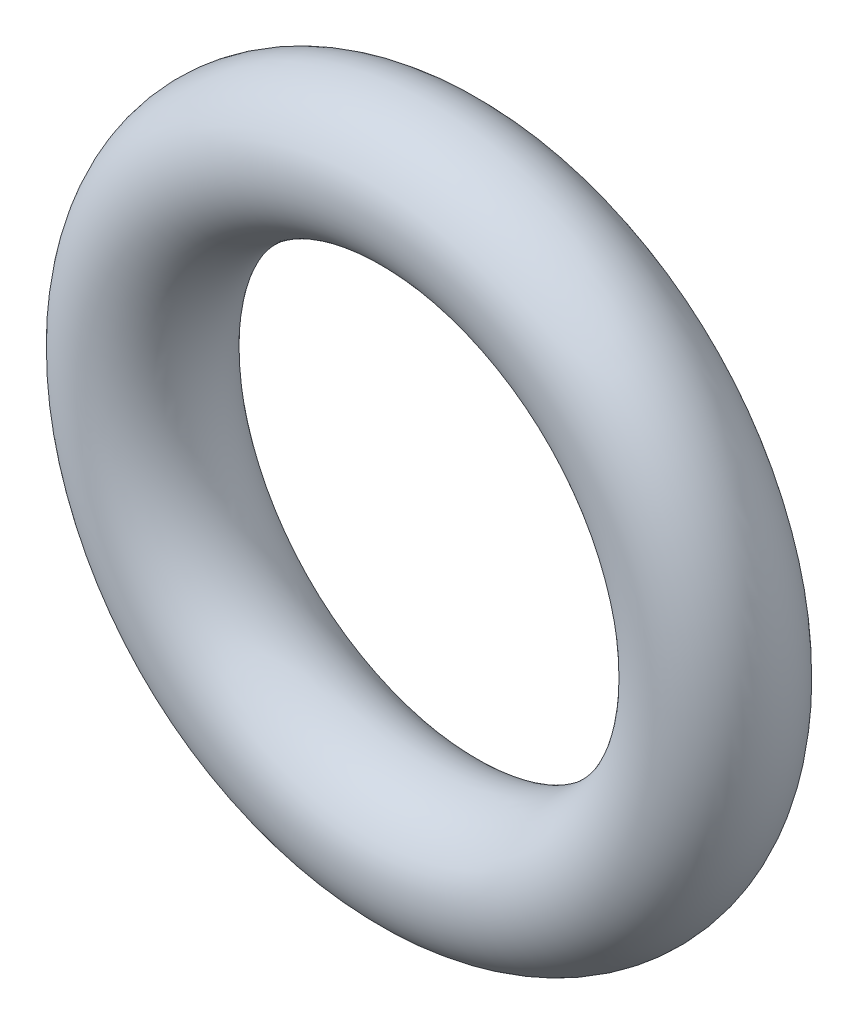
ISO-10303-21;
HEADER;
FILE_DESCRIPTION(('STEP AP214'),'2;1');
FILE_NAME('part.step','',(''),(''),'','','');
FILE_SCHEMA(('AUTOMOTIVE_DESIGN { 1 0 10303 214 1 1 1 1 }'));
ENDSEC;
DATA;
#1=APPLICATION_CONTEXT('core data for automotive mechanical design processes');
#2=APPLICATION_PROTOCOL_DEFINITION('international standard','automotive_design',2000,#1);
#3=PRODUCT_CONTEXT('',#1,'mechanical');
#4=PRODUCT('Part','Part','',(#3));
#5=PRODUCT_RELATED_PRODUCT_CATEGORY('part','',(#4));
#6=PRODUCT_DEFINITION_FORMATION('','',#4);
#7=PRODUCT_DEFINITION_CONTEXT('part definition',#1,'design');
#8=PRODUCT_DEFINITION('design','',#6,#7);
#9=PRODUCT_DEFINITION_SHAPE('','',#8);
#10=(LENGTH_UNIT() NAMED_UNIT(*) SI_UNIT(.MILLI.,.METRE.));
#11=(NAMED_UNIT(*) PLANE_ANGLE_UNIT() SI_UNIT($,.RADIAN.));
#12=(NAMED_UNIT(*) SI_UNIT($,.STERADIAN.) SOLID_ANGLE_UNIT());
#13=UNCERTAINTY_MEASURE_WITH_UNIT(LENGTH_MEASURE(1.E-05),#10,'distance_accuracy_value','');
#14=(GEOMETRIC_REPRESENTATION_CONTEXT(3) GLOBAL_UNCERTAINTY_ASSIGNED_CONTEXT((#13)) GLOBAL_UNIT_ASSIGNED_CONTEXT((#10,
#11,#12)) REPRESENTATION_CONTEXT('',''));
#15=CARTESIAN_POINT('',(0.,0.,0.));
#16=DIRECTION('',(0.,0.,1.));
#17=DIRECTION('',(1.,0.,0.));
#18=AXIS2_PLACEMENT_3D('',#15,#16,#17);
#19=CARTESIAN_POINT('',(0.,0.,0.));
#20=DIRECTION('',(0.,0.,1.));
#21=DIRECTION('',(1.,0.,0.));
#22=AXIS2_PLACEMENT_3D('',#19,#20,#21);
#23=TOROIDAL_SURFACE('',#22,2.1,0.5);
#24=CARTESIAN_POINT('',(2.1,0.,0.));
#25=DIRECTION('',(0.,1.,0.));
#26=DIRECTION('',(-1.,0.,0.));
#27=AXIS2_PLACEMENT_3D('',#24,#25,#26);
#28=CIRCLE('',#27,0.5);
#29=CARTESIAN_POINT('',(2.6,0.,0.));
#30=VERTEX_POINT('',#29);
#31=EDGE_CURVE('E11',#30,#30,#28,.T.);
#32=CARTESIAN_POINT('',(0.,0.,0.));
#33=DIRECTION('',(0.,0.,1.));
#34=DIRECTION('',(1.,0.,0.));
#35=AXIS2_PLACEMENT_3D('',#32,#33,#34);
#36=CIRCLE('',#35,2.6);
#37=EDGE_CURVE('',#30,#30,#36,.T.);
#38=ORIENTED_EDGE('',*,*,#31,.T.);
#39=ORIENTED_EDGE('',*,*,#31,.F.);
#40=ORIENTED_EDGE('',*,*,#37,.T.);
#41=ORIENTED_EDGE('',*,*,#37,.F.);
#42=EDGE_LOOP('',(#38,#40,#39,#41));
#43=FACE_BOUND('',#42,.T.);
#44=ADVANCED_FACE('F47',(#43),#23,.T.);
#45=CLOSED_SHELL('',(#44));
#46=MANIFOLD_SOLID_BREP('B2',#45);
#47=ADVANCED_BREP_SHAPE_REPRESENTATION('',(#18,#46),#14);
#48=SHAPE_DEFINITION_REPRESENTATION(#9,#47);
ENDSEC;
END-ISO-10303-21;
